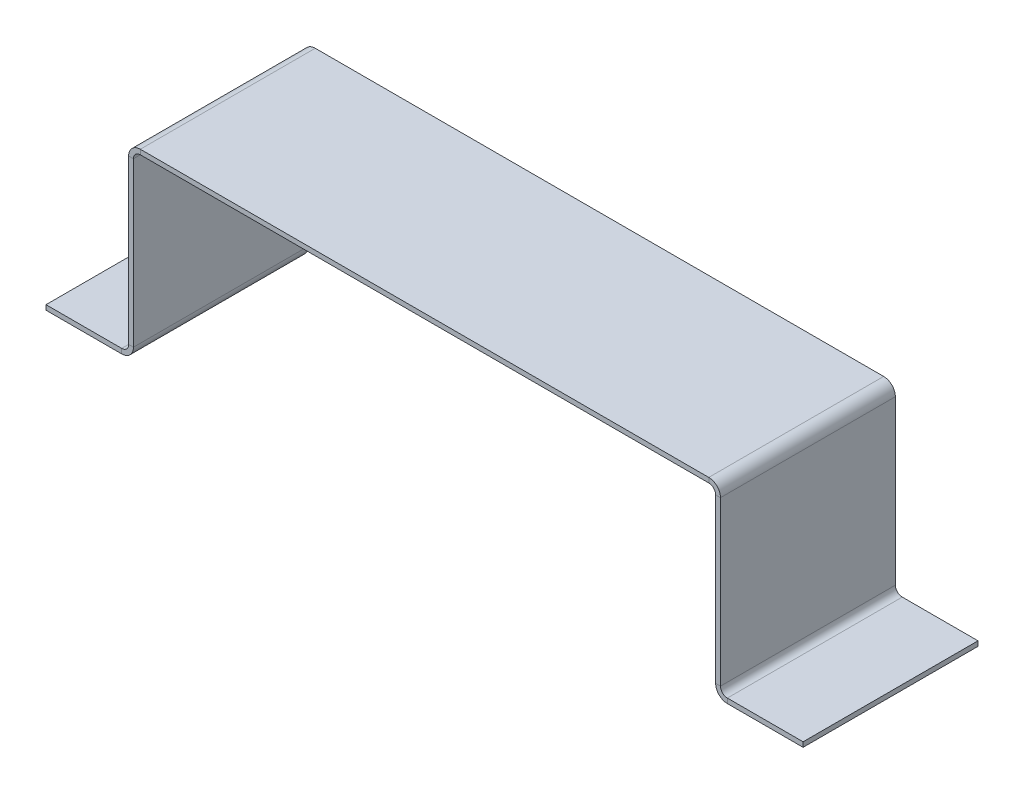
ISO-10303-21;
HEADER;
FILE_DESCRIPTION(('STEP AP214'),'2;1');
FILE_NAME('part.step','',(''),(''),'','','');
FILE_SCHEMA(('AUTOMOTIVE_DESIGN { 1 0 10303 214 1 1 1 1 }'));
ENDSEC;
DATA;
#1=APPLICATION_CONTEXT('core data for automotive mechanical design processes');
#2=APPLICATION_PROTOCOL_DEFINITION('international standard','automotive_design',2000,#1);
#3=PRODUCT_CONTEXT('',#1,'mechanical');
#4=PRODUCT('Part','Part','',(#3));
#5=PRODUCT_RELATED_PRODUCT_CATEGORY('part','',(#4));
#6=PRODUCT_DEFINITION_FORMATION('','',#4);
#7=PRODUCT_DEFINITION_CONTEXT('part definition',#1,'design');
#8=PRODUCT_DEFINITION('design','',#6,#7);
#9=PRODUCT_DEFINITION_SHAPE('','',#8);
#10=(LENGTH_UNIT() NAMED_UNIT(*) SI_UNIT(.MILLI.,.METRE.));
#11=(NAMED_UNIT(*) PLANE_ANGLE_UNIT() SI_UNIT($,.RADIAN.));
#12=(NAMED_UNIT(*) SI_UNIT($,.STERADIAN.) SOLID_ANGLE_UNIT());
#13=UNCERTAINTY_MEASURE_WITH_UNIT(LENGTH_MEASURE(1.E-05),#10,'distance_accuracy_value','');
#14=(GEOMETRIC_REPRESENTATION_CONTEXT(3) GLOBAL_UNCERTAINTY_ASSIGNED_CONTEXT((#13)) GLOBAL_UNIT_ASSIGNED_CONTEXT((#10,
#11,#12)) REPRESENTATION_CONTEXT('',''));
#15=CARTESIAN_POINT('',(0.,0.,0.));
#16=DIRECTION('',(0.,0.,1.));
#17=DIRECTION('',(1.,0.,0.));
#18=AXIS2_PLACEMENT_3D('',#15,#16,#17);
#19=CARTESIAN_POINT('',(-41.275,-0.7,12.7));
#20=DIRECTION('',(0.,0.,1.));
#21=DIRECTION('',(1.,0.,0.));
#22=AXIS2_PLACEMENT_3D('',#19,#20,#21);
#23=PLANE('',#22);
#24=DIRECTION('',(1.,0.,0.));
#25=VECTOR('',#24,1.);
#26=CARTESIAN_POINT('',(-41.275,0.,12.7));
#27=LINE('',#26,#25);
#28=CARTESIAN_POINT('',(-41.275,0.,12.7));
#29=VERTEX_POINT('',#28);
#30=CARTESIAN_POINT('',(41.275,0.,12.7));
#31=VERTEX_POINT('',#30);
#32=EDGE_CURVE('E445',#29,#31,#27,.T.);
#33=ORIENTED_EDGE('',*,*,#32,.F.);
#34=DIRECTION('',(0.,1.,0.));
#35=VECTOR('',#34,1.);
#36=CARTESIAN_POINT('',(-41.275,-0.7,12.7));
#37=LINE('',#36,#35);
#38=CARTESIAN_POINT('',(-41.275,-0.699999999999996,12.7));
#39=VERTEX_POINT('',#38);
#40=EDGE_CURVE('E125',#39,#29,#37,.T.);
#41=ORIENTED_EDGE('',*,*,#40,.F.);
#42=DIRECTION('',(1.,0.,0.));
#43=VECTOR('',#42,1.);
#44=CARTESIAN_POINT('',(-41.275,-0.7,12.7));
#45=LINE('',#44,#43);
#46=CARTESIAN_POINT('',(41.275,-0.699999999999996,12.7));
#47=VERTEX_POINT('',#46);
#48=EDGE_CURVE('E450',#39,#47,#45,.T.);
#49=ORIENTED_EDGE('',*,*,#48,.T.);
#50=DIRECTION('',(0.,1.,0.));
#51=VECTOR('',#50,1.);
#52=CARTESIAN_POINT('',(41.275,-0.7,12.7));
#53=LINE('',#52,#51);
#54=EDGE_CURVE('E13',#47,#31,#53,.T.);
#55=ORIENTED_EDGE('',*,*,#54,.T.);
#56=EDGE_LOOP('',(#33,#41,#49,#55));
#57=FACE_BOUND('',#56,.T.);
#58=ADVANCED_FACE('F116',(#57),#23,.T.);
#59=CARTESIAN_POINT('',(-41.275,-0.7,-12.7));
#60=DIRECTION('',(0.,0.,-1.));
#61=DIRECTION('',(-1.,0.,0.));
#62=AXIS2_PLACEMENT_3D('',#59,#60,#61);
#63=PLANE('',#62);
#64=DIRECTION('',(-1.,0.,0.));
#65=VECTOR('',#64,1.);
#66=CARTESIAN_POINT('',(-41.275,0.,-12.7));
#67=LINE('',#66,#65);
#68=CARTESIAN_POINT('',(41.275,0.,-12.7));
#69=VERTEX_POINT('',#68);
#70=CARTESIAN_POINT('',(-41.275,0.,-12.7));
#71=VERTEX_POINT('',#70);
#72=EDGE_CURVE('E455',#69,#71,#67,.T.);
#73=ORIENTED_EDGE('',*,*,#72,.F.);
#74=DIRECTION('',(0.,1.,0.));
#75=VECTOR('',#74,1.);
#76=CARTESIAN_POINT('',(41.275,-0.7,-12.7));
#77=LINE('',#76,#75);
#78=CARTESIAN_POINT('',(41.275,-0.699999999999996,-12.7));
#79=VERTEX_POINT('',#78);
#80=EDGE_CURVE('E120',#79,#69,#77,.T.);
#81=ORIENTED_EDGE('',*,*,#80,.F.);
#82=DIRECTION('',(-1.,0.,0.));
#83=VECTOR('',#82,1.);
#84=CARTESIAN_POINT('',(-41.275,-0.7,-12.7));
#85=LINE('',#84,#83);
#86=CARTESIAN_POINT('',(-41.275,-0.699999999999996,-12.7));
#87=VERTEX_POINT('',#86);
#88=EDGE_CURVE('E444',#79,#87,#85,.T.);
#89=ORIENTED_EDGE('',*,*,#88,.T.);
#90=DIRECTION('',(0.,1.,0.));
#91=VECTOR('',#90,1.);
#92=CARTESIAN_POINT('',(-41.275,-0.7,-12.7));
#93=LINE('',#92,#91);
#94=EDGE_CURVE('E463',#87,#71,#93,.T.);
#95=ORIENTED_EDGE('',*,*,#94,.T.);
#96=EDGE_LOOP('',(#73,#81,#89,#95));
#97=FACE_BOUND('',#96,.T.);
#98=ADVANCED_FACE('F118',(#97),#63,.T.);
#99=CARTESIAN_POINT('',(0.,-0.7,0.));
#100=DIRECTION('',(0.,-1.,0.));
#101=DIRECTION('',(0.,0.,-1.));
#102=AXIS2_PLACEMENT_3D('',#99,#100,#101);
#103=PLANE('',#102);
#104=DIRECTION('',(0.,0.,-1.));
#105=VECTOR('',#104,1.);
#106=CARTESIAN_POINT('',(41.275,-0.7,12.7));
#107=LINE('',#106,#105);
#108=EDGE_CURVE('E442',#47,#79,#107,.T.);
#109=ORIENTED_EDGE('',*,*,#108,.F.);
#110=ORIENTED_EDGE('',*,*,#48,.F.);
#111=DIRECTION('',(0.,0.,1.));
#112=VECTOR('',#111,1.);
#113=CARTESIAN_POINT('',(-41.275,-0.7,12.7));
#114=LINE('',#113,#112);
#115=EDGE_CURVE('E448',#87,#39,#114,.T.);
#116=ORIENTED_EDGE('',*,*,#115,.F.);
#117=ORIENTED_EDGE('',*,*,#88,.F.);
#118=EDGE_LOOP('',(#109,#110,#116,#117));
#119=FACE_BOUND('',#118,.T.);
#120=ADVANCED_FACE('F486',(#119),#103,.T.);
#121=CARTESIAN_POINT('',(0.,0.,0.));
#122=DIRECTION('',(0.,-1.,0.));
#123=DIRECTION('',(0.,0.,-1.));
#124=AXIS2_PLACEMENT_3D('',#121,#122,#123);
#125=PLANE('',#124);
#126=DIRECTION('',(0.,0.,-1.));
#127=VECTOR('',#126,1.);
#128=CARTESIAN_POINT('',(41.275,0.,12.7));
#129=LINE('',#128,#127);
#130=EDGE_CURVE('E433',#31,#69,#129,.T.);
#131=ORIENTED_EDGE('',*,*,#130,.T.);
#132=ORIENTED_EDGE('',*,*,#72,.T.);
#133=DIRECTION('',(0.,0.,1.));
#134=VECTOR('',#133,1.);
#135=CARTESIAN_POINT('',(-41.275,0.,12.7));
#136=LINE('',#135,#134);
#137=EDGE_CURVE('E458',#71,#29,#136,.T.);
#138=ORIENTED_EDGE('',*,*,#137,.T.);
#139=ORIENTED_EDGE('',*,*,#32,.T.);
#140=EDGE_LOOP('',(#131,#132,#138,#139));
#141=FACE_BOUND('',#140,.T.);
#142=ADVANCED_FACE('F473',(#141),#125,.F.);
#143=CARTESIAN_POINT('',(41.275,-1.7,-12.7));
#144=DIRECTION('',(0.,0.,-1.));
#145=DIRECTION('',(-1.,0.,0.));
#146=AXIS2_PLACEMENT_3D('',#143,#144,#145);
#147=PLANE('',#146);
#148=DIRECTION('',(1.,0.,0.));
#149=VECTOR('',#148,1.);
#150=CARTESIAN_POINT('',(42.975,-1.69999999999999,-12.7));
#151=LINE('',#150,#149);
#152=CARTESIAN_POINT('',(42.275,-1.69999999999999,-12.7));
#153=VERTEX_POINT('',#152);
#154=CARTESIAN_POINT('',(42.975,-1.69999999999999,-12.7));
#155=VERTEX_POINT('',#154);
#156=EDGE_CURVE('E389',#153,#155,#151,.T.);
#157=ORIENTED_EDGE('',*,*,#156,.F.);
#158=CARTESIAN_POINT('',(41.275,-1.7,-12.7));
#159=DIRECTION('',(0.,0.,1.));
#160=DIRECTION('',(1.,0.,0.));
#161=AXIS2_PLACEMENT_3D('',#158,#159,#160);
#162=CIRCLE('',#161,1.);
#163=EDGE_CURVE('E437',#79,#153,#162,.F.);
#164=ORIENTED_EDGE('',*,*,#163,.F.);
#165=ORIENTED_EDGE('',*,*,#80,.T.);
#166=CARTESIAN_POINT('',(41.275,-1.7,-12.7));
#167=DIRECTION('',(0.,0.,1.));
#168=DIRECTION('',(1.,0.,0.));
#169=AXIS2_PLACEMENT_3D('',#166,#167,#168);
#170=CIRCLE('',#169,1.7);
#171=EDGE_CURVE('E141',#69,#155,#170,.F.);
#172=ORIENTED_EDGE('',*,*,#171,.T.);
#173=EDGE_LOOP('',(#157,#164,#165,#172));
#174=FACE_BOUND('',#173,.T.);
#175=ADVANCED_FACE('F470',(#174),#147,.T.);
#176=CARTESIAN_POINT('',(41.275,-1.7,12.7));
#177=DIRECTION('',(0.,0.,-1.));
#178=DIRECTION('',(-1.,0.,0.));
#179=AXIS2_PLACEMENT_3D('',#176,#177,#178);
#180=PLANE('',#179);
#181=CARTESIAN_POINT('',(41.275,-1.7,12.7));
#182=DIRECTION('',(0.,0.,1.));
#183=DIRECTION('',(1.,0.,0.));
#184=AXIS2_PLACEMENT_3D('',#181,#182,#183);
#185=CIRCLE('',#184,1.);
#186=CARTESIAN_POINT('',(42.275,-1.69999999999999,12.7));
#187=VERTEX_POINT('',#186);
#188=EDGE_CURVE('E401',#187,#47,#185,.T.);
#189=ORIENTED_EDGE('',*,*,#188,.F.);
#190=DIRECTION('',(1.,0.,0.));
#191=VECTOR('',#190,1.);
#192=CARTESIAN_POINT('',(42.275,-1.69999999999999,12.7));
#193=LINE('',#192,#191);
#194=CARTESIAN_POINT('',(42.975,-1.69999999999999,12.7));
#195=VERTEX_POINT('',#194);
#196=EDGE_CURVE('E425',#187,#195,#193,.T.);
#197=ORIENTED_EDGE('',*,*,#196,.T.);
#198=CARTESIAN_POINT('',(41.275,-1.7,12.7));
#199=DIRECTION('',(0.,0.,1.));
#200=DIRECTION('',(1.,0.,0.));
#201=AXIS2_PLACEMENT_3D('',#198,#199,#200);
#202=CIRCLE('',#201,1.7);
#203=EDGE_CURVE('E434',#195,#31,#202,.T.);
#204=ORIENTED_EDGE('',*,*,#203,.T.);
#205=ORIENTED_EDGE('',*,*,#54,.F.);
#206=EDGE_LOOP('',(#189,#197,#204,#205));
#207=FACE_BOUND('',#206,.T.);
#208=ADVANCED_FACE('F478',(#207),#180,.F.);
#209=CARTESIAN_POINT('',(41.275,-1.7,12.7));
#210=DIRECTION('',(0.,0.,1.));
#211=DIRECTION('',(1.,0.,0.));
#212=AXIS2_PLACEMENT_3D('',#209,#210,#211);
#213=CYLINDRICAL_SURFACE('',#212,1.7);
#214=ORIENTED_EDGE('',*,*,#130,.F.);
#215=ORIENTED_EDGE('',*,*,#203,.F.);
#216=DIRECTION('',(0.,0.,1.));
#217=VECTOR('',#216,1.);
#218=CARTESIAN_POINT('',(42.975,-1.69999999999999,0.));
#219=LINE('',#218,#217);
#220=EDGE_CURVE('E422',#155,#195,#219,.T.);
#221=ORIENTED_EDGE('',*,*,#220,.F.);
#222=ORIENTED_EDGE('',*,*,#171,.F.);
#223=EDGE_LOOP('',(#214,#215,#221,#222));
#224=FACE_BOUND('',#223,.T.);
#225=ADVANCED_FACE('F475',(#224),#213,.T.);
#226=CARTESIAN_POINT('',(41.275,-1.7,12.7));
#227=DIRECTION('',(0.,0.,1.));
#228=DIRECTION('',(1.,0.,0.));
#229=AXIS2_PLACEMENT_3D('',#226,#227,#228);
#230=CYLINDRICAL_SURFACE('',#229,1.);
#231=ORIENTED_EDGE('',*,*,#108,.T.);
#232=ORIENTED_EDGE('',*,*,#163,.T.);
#233=DIRECTION('',(0.,0.,-1.));
#234=VECTOR('',#233,1.);
#235=CARTESIAN_POINT('',(42.275,-1.69999999999999,-12.7));
#236=LINE('',#235,#234);
#237=EDGE_CURVE('E428',#153,#187,#236,.F.);
#238=ORIENTED_EDGE('',*,*,#237,.T.);
#239=ORIENTED_EDGE('',*,*,#188,.T.);
#240=EDGE_LOOP('',(#231,#232,#238,#239));
#241=FACE_BOUND('',#240,.T.);
#242=ADVANCED_FACE('F488',(#241),#230,.F.);
#243=CARTESIAN_POINT('',(42.975,-0.699999999999998,12.7));
#244=DIRECTION('',(0.,0.,1.));
#245=DIRECTION('',(1.,0.,0.));
#246=AXIS2_PLACEMENT_3D('',#243,#244,#245);
#247=PLANE('',#246);
#248=DIRECTION('',(0.,1.,0.));
#249=VECTOR('',#248,1.);
#250=CARTESIAN_POINT('',(42.975,-0.699999999999998,12.7));
#251=LINE('',#250,#249);
#252=CARTESIAN_POINT('',(42.9750000000001,-25.4,12.7));
#253=VERTEX_POINT('',#252);
#254=EDGE_CURVE('E405',#253,#195,#251,.T.);
#255=ORIENTED_EDGE('',*,*,#254,.T.);
#256=ORIENTED_EDGE('',*,*,#196,.F.);
#257=DIRECTION('',(0.,-1.,0.));
#258=VECTOR('',#257,1.);
#259=CARTESIAN_POINT('',(42.275,1.39143083020455E-13,12.7));
#260=LINE('',#259,#258);
#261=CARTESIAN_POINT('',(42.2750000000001,-25.4,12.7));
#262=VERTEX_POINT('',#261);
#263=EDGE_CURVE('E413',#262,#187,#260,.F.);
#264=ORIENTED_EDGE('',*,*,#263,.F.);
#265=DIRECTION('',(-1.,0.,0.));
#266=VECTOR('',#265,1.);
#267=CARTESIAN_POINT('',(42.9750000000001,-25.4,12.7));
#268=LINE('',#267,#266);
#269=EDGE_CURVE('E398',#253,#262,#268,.T.);
#270=ORIENTED_EDGE('',*,*,#269,.F.);
#271=EDGE_LOOP('',(#255,#256,#264,#270));
#272=FACE_BOUND('',#271,.T.);
#273=ADVANCED_FACE('F496',(#272),#247,.T.);
#274=CARTESIAN_POINT('',(42.9750000000001,-25.4,-12.7));
#275=DIRECTION('',(0.,0.,-1.));
#276=DIRECTION('',(-1.,0.,0.));
#277=AXIS2_PLACEMENT_3D('',#274,#275,#276);
#278=PLANE('',#277);
#279=DIRECTION('',(0.,1.,0.));
#280=VECTOR('',#279,1.);
#281=CARTESIAN_POINT('',(42.275,1.39143083020455E-13,-12.7));
#282=LINE('',#281,#280);
#283=CARTESIAN_POINT('',(42.2750000000001,-25.4,-12.7));
#284=VERTEX_POINT('',#283);
#285=EDGE_CURVE('E419',#153,#284,#282,.F.);
#286=ORIENTED_EDGE('',*,*,#285,.F.);
#287=ORIENTED_EDGE('',*,*,#156,.T.);
#288=DIRECTION('',(0.,-1.,0.));
#289=VECTOR('',#288,1.);
#290=CARTESIAN_POINT('',(42.9750000000001,-25.4,-12.7));
#291=LINE('',#290,#289);
#292=CARTESIAN_POINT('',(42.9750000000001,-25.4,-12.7));
#293=VERTEX_POINT('',#292);
#294=EDGE_CURVE('E410',#155,#293,#291,.T.);
#295=ORIENTED_EDGE('',*,*,#294,.T.);
#296=DIRECTION('',(-1.,0.,0.));
#297=VECTOR('',#296,1.);
#298=CARTESIAN_POINT('',(42.9750000000001,-25.4,-12.7));
#299=LINE('',#298,#297);
#300=EDGE_CURVE('E402',#293,#284,#299,.T.);
#301=ORIENTED_EDGE('',*,*,#300,.T.);
#302=EDGE_LOOP('',(#286,#287,#295,#301));
#303=FACE_BOUND('',#302,.T.);
#304=ADVANCED_FACE('F503',(#303),#278,.T.);
#305=CARTESIAN_POINT('',(42.975,1.41587119957646E-13,0.));
#306=DIRECTION('',(1.,0.,0.));
#307=DIRECTION('',(0.,1.,0.));
#308=AXIS2_PLACEMENT_3D('',#305,#306,#307);
#309=PLANE('',#308);
#310=ORIENTED_EDGE('',*,*,#294,.F.);
#311=ORIENTED_EDGE('',*,*,#220,.T.);
#312=ORIENTED_EDGE('',*,*,#254,.F.);
#313=DIRECTION('',(0.,0.,1.));
#314=VECTOR('',#313,1.);
#315=CARTESIAN_POINT('',(42.9750000000001,-25.4,12.7));
#316=LINE('',#315,#314);
#317=EDGE_CURVE('E408',#293,#253,#316,.T.);
#318=ORIENTED_EDGE('',*,*,#317,.F.);
#319=EDGE_LOOP('',(#310,#311,#312,#318));
#320=FACE_BOUND('',#319,.T.);
#321=ADVANCED_FACE('F501',(#320),#309,.T.);
#322=CARTESIAN_POINT('',(42.275,1.39143083020455E-13,0.));
#323=DIRECTION('',(1.,0.,0.));
#324=DIRECTION('',(0.,1.,0.));
#325=AXIS2_PLACEMENT_3D('',#322,#323,#324);
#326=PLANE('',#325);
#327=ORIENTED_EDGE('',*,*,#237,.F.);
#328=ORIENTED_EDGE('',*,*,#285,.T.);
#329=DIRECTION('',(0.,0.,-1.));
#330=VECTOR('',#329,1.);
#331=CARTESIAN_POINT('',(42.2750000000001,-25.4,0.));
#332=LINE('',#331,#330);
#333=EDGE_CURVE('E416',#284,#262,#332,.F.);
#334=ORIENTED_EDGE('',*,*,#333,.T.);
#335=ORIENTED_EDGE('',*,*,#263,.T.);
#336=EDGE_LOOP('',(#327,#328,#334,#335));
#337=FACE_BOUND('',#336,.T.);
#338=ADVANCED_FACE('F492',(#337),#326,.F.);
#339=CARTESIAN_POINT('',(43.9750000000001,-25.4,12.7));
#340=DIRECTION('',(0.,0.,1.));
#341=DIRECTION('',(1.,0.,0.));
#342=AXIS2_PLACEMENT_3D('',#339,#340,#341);
#343=PLANE('',#342);
#344=DIRECTION('',(0.,1.,0.));
#345=VECTOR('',#344,1.);
#346=CARTESIAN_POINT('',(43.9750000000001,-27.1,12.7));
#347=LINE('',#346,#345);
#348=CARTESIAN_POINT('',(43.9750000000001,-26.4,12.7));
#349=VERTEX_POINT('',#348);
#350=CARTESIAN_POINT('',(43.9750000000001,-27.1,12.7));
#351=VERTEX_POINT('',#350);
#352=EDGE_CURVE('E347',#349,#351,#347,.F.);
#353=ORIENTED_EDGE('',*,*,#352,.F.);
#354=CARTESIAN_POINT('',(43.9750000000001,-25.4,12.7));
#355=DIRECTION('',(0.,0.,-1.));
#356=DIRECTION('',(-1.,0.,0.));
#357=AXIS2_PLACEMENT_3D('',#354,#355,#356);
#358=CIRCLE('',#357,1.);
#359=EDGE_CURVE('E393',#253,#349,#358,.F.);
#360=ORIENTED_EDGE('',*,*,#359,.F.);
#361=ORIENTED_EDGE('',*,*,#269,.T.);
#362=CARTESIAN_POINT('',(43.9750000000001,-25.4,12.7));
#363=DIRECTION('',(0.,0.,-1.));
#364=DIRECTION('',(-1.,0.,0.));
#365=AXIS2_PLACEMENT_3D('',#362,#363,#364);
#366=CIRCLE('',#365,1.7);
#367=EDGE_CURVE('E386',#262,#351,#366,.F.);
#368=ORIENTED_EDGE('',*,*,#367,.T.);
#369=EDGE_LOOP('',(#353,#360,#361,#368));
#370=FACE_BOUND('',#369,.T.);
#371=ADVANCED_FACE('F534',(#370),#343,.T.);
#372=CARTESIAN_POINT('',(43.9750000000001,-25.4,-12.7));
#373=DIRECTION('',(0.,0.,1.));
#374=DIRECTION('',(1.,0.,0.));
#375=AXIS2_PLACEMENT_3D('',#372,#373,#374);
#376=PLANE('',#375);
#377=CARTESIAN_POINT('',(43.9750000000001,-25.4,-12.7));
#378=DIRECTION('',(0.,0.,-1.));
#379=DIRECTION('',(-1.,0.,0.));
#380=AXIS2_PLACEMENT_3D('',#377,#378,#379);
#381=CIRCLE('',#380,1.);
#382=CARTESIAN_POINT('',(43.9750000000001,-26.4,-12.7));
#383=VERTEX_POINT('',#382);
#384=EDGE_CURVE('E359',#383,#293,#381,.T.);
#385=ORIENTED_EDGE('',*,*,#384,.F.);
#386=DIRECTION('',(0.,1.,0.));
#387=VECTOR('',#386,1.);
#388=CARTESIAN_POINT('',(43.9750000000001,-26.4,-12.7));
#389=LINE('',#388,#387);
#390=CARTESIAN_POINT('',(43.9750000000001,-27.1,-12.7));
#391=VERTEX_POINT('',#390);
#392=EDGE_CURVE('E379',#383,#391,#389,.F.);
#393=ORIENTED_EDGE('',*,*,#392,.T.);
#394=CARTESIAN_POINT('',(43.9750000000001,-25.4,-12.7));
#395=DIRECTION('',(0.,0.,-1.));
#396=DIRECTION('',(-1.,0.,0.));
#397=AXIS2_PLACEMENT_3D('',#394,#395,#396);
#398=CIRCLE('',#397,1.7);
#399=EDGE_CURVE('E390',#391,#284,#398,.T.);
#400=ORIENTED_EDGE('',*,*,#399,.T.);
#401=ORIENTED_EDGE('',*,*,#300,.F.);
#402=EDGE_LOOP('',(#385,#393,#400,#401));
#403=FACE_BOUND('',#402,.T.);
#404=ADVANCED_FACE('F506',(#403),#376,.F.);
#405=CARTESIAN_POINT('',(43.9750000000001,-25.4,-12.7));
#406=DIRECTION('',(0.,0.,-1.));
#407=DIRECTION('',(0.,-1.,0.));
#408=AXIS2_PLACEMENT_3D('',#405,#406,#407);
#409=CYLINDRICAL_SURFACE('',#408,1.7);
#410=ORIENTED_EDGE('',*,*,#333,.F.);
#411=ORIENTED_EDGE('',*,*,#399,.F.);
#412=DIRECTION('',(0.,0.,-1.));
#413=VECTOR('',#412,1.);
#414=CARTESIAN_POINT('',(43.9750000000001,-27.1,12.7));
#415=LINE('',#414,#413);
#416=EDGE_CURVE('E377',#391,#351,#415,.F.);
#417=ORIENTED_EDGE('',*,*,#416,.T.);
#418=ORIENTED_EDGE('',*,*,#367,.F.);
#419=EDGE_LOOP('',(#410,#411,#417,#418));
#420=FACE_BOUND('',#419,.T.);
#421=ADVANCED_FACE('F532',(#420),#409,.T.);
#422=CARTESIAN_POINT('',(43.9750000000001,-25.4,-12.7));
#423=DIRECTION('',(0.,0.,-1.));
#424=DIRECTION('',(0.,-1.,0.));
#425=AXIS2_PLACEMENT_3D('',#422,#423,#424);
#426=CYLINDRICAL_SURFACE('',#425,1.);
#427=ORIENTED_EDGE('',*,*,#317,.T.);
#428=ORIENTED_EDGE('',*,*,#359,.T.);
#429=DIRECTION('',(0.,0.,-1.));
#430=VECTOR('',#429,1.);
#431=CARTESIAN_POINT('',(43.9750000000001,-26.4,12.7));
#432=LINE('',#431,#430);
#433=EDGE_CURVE('E382',#349,#383,#432,.T.);
#434=ORIENTED_EDGE('',*,*,#433,.T.);
#435=ORIENTED_EDGE('',*,*,#384,.T.);
#436=EDGE_LOOP('',(#427,#428,#434,#435));
#437=FACE_BOUND('',#436,.T.);
#438=ADVANCED_FACE('F509',(#437),#426,.F.);
#439=CARTESIAN_POINT('',(54.9750000000001,-27.1,-12.7));
#440=DIRECTION('',(0.,0.,1.));
#441=DIRECTION('',(1.,0.,0.));
#442=AXIS2_PLACEMENT_3D('',#439,#440,#441);
#443=PLANE('',#442);
#444=ORIENTED_EDGE('',*,*,#392,.F.);
#445=DIRECTION('',(-1.,0.,0.));
#446=VECTOR('',#445,1.);
#447=CARTESIAN_POINT('',(54.9750000000001,-26.4,-12.7));
#448=LINE('',#447,#446);
#449=CARTESIAN_POINT('',(54.9750000000001,-26.4,-12.7));
#450=VERTEX_POINT('',#449);
#451=EDGE_CURVE('E375',#383,#450,#448,.F.);
#452=ORIENTED_EDGE('',*,*,#451,.T.);
#453=DIRECTION('',(0.,1.,0.));
#454=VECTOR('',#453,1.);
#455=CARTESIAN_POINT('',(54.9750000000001,-27.1,-12.7));
#456=LINE('',#455,#454);
#457=CARTESIAN_POINT('',(54.9750000000001,-27.1,-12.7));
#458=VERTEX_POINT('',#457);
#459=EDGE_CURVE('E356',#458,#450,#456,.T.);
#460=ORIENTED_EDGE('',*,*,#459,.F.);
#461=DIRECTION('',(1.,0.,0.));
#462=VECTOR('',#461,1.);
#463=CARTESIAN_POINT('',(0.,-27.1,-12.7));
#464=LINE('',#463,#462);
#465=EDGE_CURVE('E368',#391,#458,#464,.T.);
#466=ORIENTED_EDGE('',*,*,#465,.F.);
#467=EDGE_LOOP('',(#444,#452,#460,#466));
#468=FACE_BOUND('',#467,.T.);
#469=ADVANCED_FACE('F527',(#468),#443,.F.);
#470=CARTESIAN_POINT('',(42.9750000000001,-27.1,12.7));
#471=DIRECTION('',(0.,0.,-1.));
#472=DIRECTION('',(-1.,0.,0.));
#473=AXIS2_PLACEMENT_3D('',#470,#471,#472);
#474=PLANE('',#473);
#475=ORIENTED_EDGE('',*,*,#352,.T.);
#476=DIRECTION('',(-1.,0.,0.));
#477=VECTOR('',#476,1.);
#478=CARTESIAN_POINT('',(0.,-27.1,12.7));
#479=LINE('',#478,#477);
#480=CARTESIAN_POINT('',(54.9750000000001,-27.1,12.7));
#481=VERTEX_POINT('',#480);
#482=EDGE_CURVE('E363',#481,#351,#479,.T.);
#483=ORIENTED_EDGE('',*,*,#482,.F.);
#484=DIRECTION('',(0.,1.,0.));
#485=VECTOR('',#484,1.);
#486=CARTESIAN_POINT('',(54.9750000000001,-27.1,12.7));
#487=LINE('',#486,#485);
#488=CARTESIAN_POINT('',(54.9750000000001,-26.4,12.7));
#489=VERTEX_POINT('',#488);
#490=EDGE_CURVE('E360',#481,#489,#487,.T.);
#491=ORIENTED_EDGE('',*,*,#490,.T.);
#492=DIRECTION('',(1.,0.,0.));
#493=VECTOR('',#492,1.);
#494=CARTESIAN_POINT('',(42.9750000000001,-26.4,12.7));
#495=LINE('',#494,#493);
#496=EDGE_CURVE('E370',#489,#349,#495,.F.);
#497=ORIENTED_EDGE('',*,*,#496,.T.);
#498=EDGE_LOOP('',(#475,#483,#491,#497));
#499=FACE_BOUND('',#498,.T.);
#500=ADVANCED_FACE('F518',(#499),#474,.F.);
#501=CARTESIAN_POINT('',(0.,-27.1,0.));
#502=DIRECTION('',(0.,1.,0.));
#503=DIRECTION('',(0.,0.,1.));
#504=AXIS2_PLACEMENT_3D('',#501,#502,#503);
#505=PLANE('',#504);
#506=ORIENTED_EDGE('',*,*,#416,.F.);
#507=ORIENTED_EDGE('',*,*,#465,.T.);
#508=DIRECTION('',(0.,0.,1.));
#509=VECTOR('',#508,1.);
#510=CARTESIAN_POINT('',(54.9750000000001,-27.1,0.));
#511=LINE('',#510,#509);
#512=EDGE_CURVE('E366',#458,#481,#511,.T.);
#513=ORIENTED_EDGE('',*,*,#512,.T.);
#514=ORIENTED_EDGE('',*,*,#482,.T.);
#515=EDGE_LOOP('',(#506,#507,#513,#514));
#516=FACE_BOUND('',#515,.T.);
#517=ADVANCED_FACE('F530',(#516),#505,.F.);
#518=CARTESIAN_POINT('',(0.,-26.4,0.));
#519=DIRECTION('',(0.,1.,0.));
#520=DIRECTION('',(0.,0.,1.));
#521=AXIS2_PLACEMENT_3D('',#518,#519,#520);
#522=PLANE('',#521);
#523=ORIENTED_EDGE('',*,*,#451,.F.);
#524=ORIENTED_EDGE('',*,*,#433,.F.);
#525=ORIENTED_EDGE('',*,*,#496,.F.);
#526=DIRECTION('',(0.,0.,-1.));
#527=VECTOR('',#526,1.);
#528=CARTESIAN_POINT('',(54.9750000000001,-26.4,12.7));
#529=LINE('',#528,#527);
#530=EDGE_CURVE('E373',#450,#489,#529,.F.);
#531=ORIENTED_EDGE('',*,*,#530,.F.);
#532=EDGE_LOOP('',(#523,#524,#525,#531));
#533=FACE_BOUND('',#532,.T.);
#534=ADVANCED_FACE('F515',(#533),#522,.T.);
#535=CARTESIAN_POINT('',(54.9750000000001,-27.1,12.7));
#536=DIRECTION('',(-1.,0.,0.));
#537=DIRECTION('',(0.,-1.,0.));
#538=AXIS2_PLACEMENT_3D('',#535,#536,#537);
#539=PLANE('',#538);
#540=ORIENTED_EDGE('',*,*,#530,.T.);
#541=ORIENTED_EDGE('',*,*,#490,.F.);
#542=ORIENTED_EDGE('',*,*,#512,.F.);
#543=ORIENTED_EDGE('',*,*,#459,.T.);
#544=EDGE_LOOP('',(#540,#541,#542,#543));
#545=FACE_BOUND('',#544,.T.);
#546=ADVANCED_FACE('F523',(#545),#539,.F.);
#547=CARTESIAN_POINT('',(-41.275,-1.7,12.7));
#548=DIRECTION('',(0.,0.,1.));
#549=DIRECTION('',(1.,0.,0.));
#550=AXIS2_PLACEMENT_3D('',#547,#548,#549);
#551=PLANE('',#550);
#552=DIRECTION('',(-1.,0.,0.));
#553=VECTOR('',#552,1.);
#554=CARTESIAN_POINT('',(-42.975,-1.69999999999999,12.7));
#555=LINE('',#554,#553);
#556=CARTESIAN_POINT('',(-42.275,-1.69999999999999,12.7));
#557=VERTEX_POINT('',#556);
#558=CARTESIAN_POINT('',(-42.975,-1.69999999999999,12.7));
#559=VERTEX_POINT('',#558);
#560=EDGE_CURVE('E310',#557,#559,#555,.T.);
#561=ORIENTED_EDGE('',*,*,#560,.F.);
#562=CARTESIAN_POINT('',(-41.275,-1.7,12.7));
#563=DIRECTION('',(0.,0.,-1.));
#564=DIRECTION('',(-1.,0.,0.));
#565=AXIS2_PLACEMENT_3D('',#562,#563,#564);
#566=CIRCLE('',#565,1.);
#567=EDGE_CURVE('E351',#39,#557,#566,.F.);
#568=ORIENTED_EDGE('',*,*,#567,.F.);
#569=ORIENTED_EDGE('',*,*,#40,.T.);
#570=CARTESIAN_POINT('',(-41.275,-1.7,12.7));
#571=DIRECTION('',(0.,0.,-1.));
#572=DIRECTION('',(-1.,0.,0.));
#573=AXIS2_PLACEMENT_3D('',#570,#571,#572);
#574=CIRCLE('',#573,1.7);
#575=EDGE_CURVE('E133',#29,#559,#574,.F.);
#576=ORIENTED_EDGE('',*,*,#575,.T.);
#577=EDGE_LOOP('',(#561,#568,#569,#576));
#578=FACE_BOUND('',#577,.T.);
#579=ADVANCED_FACE('F648',(#578),#551,.T.);
#580=CARTESIAN_POINT('',(-41.275,-1.7,-12.7));
#581=DIRECTION('',(0.,0.,1.));
#582=DIRECTION('',(1.,0.,0.));
#583=AXIS2_PLACEMENT_3D('',#580,#581,#582);
#584=PLANE('',#583);
#585=CARTESIAN_POINT('',(-41.275,-1.7,-12.7));
#586=DIRECTION('',(0.,0.,-1.));
#587=DIRECTION('',(-1.,0.,0.));
#588=AXIS2_PLACEMENT_3D('',#585,#586,#587);
#589=CIRCLE('',#588,1.);
#590=CARTESIAN_POINT('',(-42.275,-1.69999999999999,-12.7));
#591=VERTEX_POINT('',#590);
#592=EDGE_CURVE('E318',#591,#87,#589,.T.);
#593=ORIENTED_EDGE('',*,*,#592,.F.);
#594=DIRECTION('',(-1.,0.,0.));
#595=VECTOR('',#594,1.);
#596=CARTESIAN_POINT('',(-42.275,-1.69999999999999,-12.7));
#597=LINE('',#596,#595);
#598=CARTESIAN_POINT('',(-42.975,-1.69999999999999,-12.7));
#599=VERTEX_POINT('',#598);
#600=EDGE_CURVE('E339',#591,#599,#597,.T.);
#601=ORIENTED_EDGE('',*,*,#600,.T.);
#602=CARTESIAN_POINT('',(-41.275,-1.7,-12.7));
#603=DIRECTION('',(0.,0.,-1.));
#604=DIRECTION('',(-1.,0.,0.));
#605=AXIS2_PLACEMENT_3D('',#602,#603,#604);
#606=CIRCLE('',#605,1.7);
#607=EDGE_CURVE('E348',#599,#71,#606,.T.);
#608=ORIENTED_EDGE('',*,*,#607,.T.);
#609=ORIENTED_EDGE('',*,*,#94,.F.);
#610=EDGE_LOOP('',(#593,#601,#608,#609));
#611=FACE_BOUND('',#610,.T.);
#612=ADVANCED_FACE('F686',(#611),#584,.F.);
#613=CARTESIAN_POINT('',(-41.275,-1.7,-12.7));
#614=DIRECTION('',(0.,0.,-1.));
#615=DIRECTION('',(-1.,0.,0.));
#616=AXIS2_PLACEMENT_3D('',#613,#614,#615);
#617=CYLINDRICAL_SURFACE('',#616,1.7);
#618=ORIENTED_EDGE('',*,*,#137,.F.);
#619=ORIENTED_EDGE('',*,*,#607,.F.);
#620=DIRECTION('',(0.,0.,-1.));
#621=VECTOR('',#620,1.);
#622=CARTESIAN_POINT('',(-42.975,-1.69999999999999,0.));
#623=LINE('',#622,#621);
#624=EDGE_CURVE('E336',#559,#599,#623,.T.);
#625=ORIENTED_EDGE('',*,*,#624,.F.);
#626=ORIENTED_EDGE('',*,*,#575,.F.);
#627=EDGE_LOOP('',(#618,#619,#625,#626));
#628=FACE_BOUND('',#627,.T.);
#629=ADVANCED_FACE('F697',(#628),#617,.T.);
#630=CARTESIAN_POINT('',(-41.275,-1.7,-12.7));
#631=DIRECTION('',(0.,0.,-1.));
#632=DIRECTION('',(-1.,0.,0.));
#633=AXIS2_PLACEMENT_3D('',#630,#631,#632);
#634=CYLINDRICAL_SURFACE('',#633,1.);
#635=ORIENTED_EDGE('',*,*,#115,.T.);
#636=ORIENTED_EDGE('',*,*,#567,.T.);
#637=DIRECTION('',(0.,0.,1.));
#638=VECTOR('',#637,1.);
#639=CARTESIAN_POINT('',(-42.275,-1.69999999999999,12.7));
#640=LINE('',#639,#638);
#641=EDGE_CURVE('E342',#557,#591,#640,.F.);
#642=ORIENTED_EDGE('',*,*,#641,.T.);
#643=ORIENTED_EDGE('',*,*,#592,.T.);
#644=EDGE_LOOP('',(#635,#636,#642,#643));
#645=FACE_BOUND('',#644,.T.);
#646=ADVANCED_FACE('F708',(#645),#634,.F.);
#647=CARTESIAN_POINT('',(-42.975,-0.699999999999998,-12.7));
#648=DIRECTION('',(0.,0.,-1.));
#649=DIRECTION('',(-1.,0.,0.));
#650=AXIS2_PLACEMENT_3D('',#647,#648,#649);
#651=PLANE('',#650);
#652=DIRECTION('',(0.,1.,0.));
#653=VECTOR('',#652,1.);
#654=CARTESIAN_POINT('',(-42.975,-0.699999999999998,-12.7));
#655=LINE('',#654,#653);
#656=CARTESIAN_POINT('',(-42.9750000000001,-25.4,-12.7));
#657=VERTEX_POINT('',#656);
#658=EDGE_CURVE('E322',#657,#599,#655,.T.);
#659=ORIENTED_EDGE('',*,*,#658,.T.);
#660=ORIENTED_EDGE('',*,*,#600,.F.);
#661=DIRECTION('',(0.,-1.,0.));
#662=VECTOR('',#661,1.);
#663=CARTESIAN_POINT('',(-42.275,1.39143083020455E-13,-12.7));
#664=LINE('',#663,#662);
#665=CARTESIAN_POINT('',(-42.2750000000001,-25.4,-12.7));
#666=VERTEX_POINT('',#665);
#667=EDGE_CURVE('E330',#666,#591,#664,.F.);
#668=ORIENTED_EDGE('',*,*,#667,.F.);
#669=DIRECTION('',(1.,0.,0.));
#670=VECTOR('',#669,1.);
#671=CARTESIAN_POINT('',(-42.9750000000001,-25.4,-12.7));
#672=LINE('',#671,#670);
#673=EDGE_CURVE('E315',#657,#666,#672,.T.);
#674=ORIENTED_EDGE('',*,*,#673,.F.);
#675=EDGE_LOOP('',(#659,#660,#668,#674));
#676=FACE_BOUND('',#675,.T.);
#677=ADVANCED_FACE('F718',(#676),#651,.T.);
#678=CARTESIAN_POINT('',(-42.9750000000001,-25.4,12.7));
#679=DIRECTION('',(0.,0.,1.));
#680=DIRECTION('',(1.,0.,0.));
#681=AXIS2_PLACEMENT_3D('',#678,#679,#680);
#682=PLANE('',#681);
#683=DIRECTION('',(0.,1.,0.));
#684=VECTOR('',#683,1.);
#685=CARTESIAN_POINT('',(-42.275,1.39143083020455E-13,12.7));
#686=LINE('',#685,#684);
#687=CARTESIAN_POINT('',(-42.2750000000001,-25.4,12.7));
#688=VERTEX_POINT('',#687);
#689=EDGE_CURVE('E334',#557,#688,#686,.F.);
#690=ORIENTED_EDGE('',*,*,#689,.F.);
#691=ORIENTED_EDGE('',*,*,#560,.T.);
#692=DIRECTION('',(0.,-1.,0.));
#693=VECTOR('',#692,1.);
#694=CARTESIAN_POINT('',(-42.9750000000001,-25.4,12.7));
#695=LINE('',#694,#693);
#696=CARTESIAN_POINT('',(-42.9750000000001,-25.4,12.7));
#697=VERTEX_POINT('',#696);
#698=EDGE_CURVE('E327',#559,#697,#695,.T.);
#699=ORIENTED_EDGE('',*,*,#698,.T.);
#700=DIRECTION('',(1.,0.,0.));
#701=VECTOR('',#700,1.);
#702=CARTESIAN_POINT('',(-42.9750000000001,-25.4,12.7));
#703=LINE('',#702,#701);
#704=EDGE_CURVE('E319',#697,#688,#703,.T.);
#705=ORIENTED_EDGE('',*,*,#704,.T.);
#706=EDGE_LOOP('',(#690,#691,#699,#705));
#707=FACE_BOUND('',#706,.T.);
#708=ADVANCED_FACE('F729',(#707),#682,.T.);
#709=CARTESIAN_POINT('',(-42.975,1.41587119957646E-13,0.));
#710=DIRECTION('',(-1.,0.,0.));
#711=DIRECTION('',(0.,-1.,0.));
#712=AXIS2_PLACEMENT_3D('',#709,#710,#711);
#713=PLANE('',#712);
#714=ORIENTED_EDGE('',*,*,#698,.F.);
#715=ORIENTED_EDGE('',*,*,#624,.T.);
#716=ORIENTED_EDGE('',*,*,#658,.F.);
#717=DIRECTION('',(0.,0.,-1.));
#718=VECTOR('',#717,1.);
#719=CARTESIAN_POINT('',(-42.9750000000001,-25.4,-12.7));
#720=LINE('',#719,#718);
#721=EDGE_CURVE('E325',#697,#657,#720,.T.);
#722=ORIENTED_EDGE('',*,*,#721,.F.);
#723=EDGE_LOOP('',(#714,#715,#716,#722));
#724=FACE_BOUND('',#723,.T.);
#725=ADVANCED_FACE('F740',(#724),#713,.T.);
#726=CARTESIAN_POINT('',(-42.275,1.39143083020455E-13,0.));
#727=DIRECTION('',(-1.,0.,0.));
#728=DIRECTION('',(0.,-1.,0.));
#729=AXIS2_PLACEMENT_3D('',#726,#727,#728);
#730=PLANE('',#729);
#731=ORIENTED_EDGE('',*,*,#641,.F.);
#732=ORIENTED_EDGE('',*,*,#689,.T.);
#733=DIRECTION('',(0.,0.,1.));
#734=VECTOR('',#733,1.);
#735=CARTESIAN_POINT('',(-42.2750000000001,-25.4,0.));
#736=LINE('',#735,#734);
#737=EDGE_CURVE('E261',#688,#666,#736,.F.);
#738=ORIENTED_EDGE('',*,*,#737,.T.);
#739=ORIENTED_EDGE('',*,*,#667,.T.);
#740=EDGE_LOOP('',(#731,#732,#738,#739));
#741=FACE_BOUND('',#740,.T.);
#742=ADVANCED_FACE('F751',(#741),#730,.F.);
#743=CARTESIAN_POINT('',(-43.9750000000001,-25.4,-12.7));
#744=DIRECTION('',(0.,0.,-1.));
#745=DIRECTION('',(-1.,0.,0.));
#746=AXIS2_PLACEMENT_3D('',#743,#744,#745);
#747=PLANE('',#746);
#748=DIRECTION('',(0.,-1.,0.));
#749=VECTOR('',#748,1.);
#750=CARTESIAN_POINT('',(-43.9750000000001,-27.1,-12.7));
#751=LINE('',#750,#749);
#752=CARTESIAN_POINT('',(-43.9750000000001,-26.4,-12.7));
#753=VERTEX_POINT('',#752);
#754=CARTESIAN_POINT('',(-43.9750000000001,-27.1,-12.7));
#755=VERTEX_POINT('',#754);
#756=EDGE_CURVE('E307',#753,#755,#751,.T.);
#757=ORIENTED_EDGE('',*,*,#756,.F.);
#758=CARTESIAN_POINT('',(-43.9750000000001,-25.4,-12.7));
#759=DIRECTION('',(0.,0.,1.));
#760=DIRECTION('',(1.,0.,0.));
#761=AXIS2_PLACEMENT_3D('',#758,#759,#760);
#762=CIRCLE('',#761,1.);
#763=EDGE_CURVE('E265',#657,#753,#762,.F.);
#764=ORIENTED_EDGE('',*,*,#763,.F.);
#765=ORIENTED_EDGE('',*,*,#673,.T.);
#766=CARTESIAN_POINT('',(-43.9750000000001,-25.4,-12.7));
#767=DIRECTION('',(0.,0.,1.));
#768=DIRECTION('',(1.,0.,0.));
#769=AXIS2_PLACEMENT_3D('',#766,#767,#768);
#770=CIRCLE('',#769,1.7);
#771=EDGE_CURVE('E264',#666,#755,#770,.F.);
#772=ORIENTED_EDGE('',*,*,#771,.T.);
#773=EDGE_LOOP('',(#757,#764,#765,#772));
#774=FACE_BOUND('',#773,.T.);
#775=ADVANCED_FACE('F762',(#774),#747,.T.);
#776=CARTESIAN_POINT('',(-43.9750000000001,-25.4,12.7));
#777=DIRECTION('',(0.,0.,-1.));
#778=DIRECTION('',(-1.,0.,0.));
#779=AXIS2_PLACEMENT_3D('',#776,#777,#778);
#780=PLANE('',#779);
#781=CARTESIAN_POINT('',(-43.9750000000001,-25.4,12.7));
#782=DIRECTION('',(0.,0.,1.));
#783=DIRECTION('',(1.,0.,0.));
#784=AXIS2_PLACEMENT_3D('',#781,#782,#783);
#785=CIRCLE('',#784,1.);
#786=CARTESIAN_POINT('',(-43.9750000000001,-26.4,12.7));
#787=VERTEX_POINT('',#786);
#788=EDGE_CURVE('E272',#787,#697,#785,.T.);
#789=ORIENTED_EDGE('',*,*,#788,.F.);
#790=DIRECTION('',(0.,-1.,0.));
#791=VECTOR('',#790,1.);
#792=CARTESIAN_POINT('',(-43.9750000000001,-26.4,12.7));
#793=LINE('',#792,#791);
#794=CARTESIAN_POINT('',(-43.9750000000001,-27.1,12.7));
#795=VERTEX_POINT('',#794);
#796=EDGE_CURVE('E269',#787,#795,#793,.T.);
#797=ORIENTED_EDGE('',*,*,#796,.T.);
#798=CARTESIAN_POINT('',(-43.9750000000001,-25.4,12.7));
#799=DIRECTION('',(0.,0.,1.));
#800=DIRECTION('',(1.,0.,0.));
#801=AXIS2_PLACEMENT_3D('',#798,#799,#800);
#802=CIRCLE('',#801,1.7);
#803=EDGE_CURVE('E254',#795,#688,#802,.T.);
#804=ORIENTED_EDGE('',*,*,#803,.T.);
#805=ORIENTED_EDGE('',*,*,#704,.F.);
#806=EDGE_LOOP('',(#789,#797,#804,#805));
#807=FACE_BOUND('',#806,.T.);
#808=ADVANCED_FACE('F270',(#807),#780,.F.);
#809=CARTESIAN_POINT('',(-43.9750000000001,-25.4,12.7));
#810=DIRECTION('',(0.,0.,1.));
#811=DIRECTION('',(0.,-1.,0.));
#812=AXIS2_PLACEMENT_3D('',#809,#810,#811);
#813=CYLINDRICAL_SURFACE('',#812,1.7);
#814=ORIENTED_EDGE('',*,*,#737,.F.);
#815=ORIENTED_EDGE('',*,*,#803,.F.);
#816=DIRECTION('',(0.,0.,1.));
#817=VECTOR('',#816,1.);
#818=CARTESIAN_POINT('',(-43.9750000000001,-27.1,0.));
#819=LINE('',#818,#817);
#820=EDGE_CURVE('E258',#755,#795,#819,.T.);
#821=ORIENTED_EDGE('',*,*,#820,.F.);
#822=ORIENTED_EDGE('',*,*,#771,.F.);
#823=EDGE_LOOP('',(#814,#815,#821,#822));
#824=FACE_BOUND('',#823,.T.);
#825=ADVANCED_FACE('F256',(#824),#813,.T.);
#826=CARTESIAN_POINT('',(-43.9750000000001,-25.4,12.7));
#827=DIRECTION('',(0.,0.,1.));
#828=DIRECTION('',(0.,-1.,0.));
#829=AXIS2_PLACEMENT_3D('',#826,#827,#828);
#830=CYLINDRICAL_SURFACE('',#829,1.);
#831=ORIENTED_EDGE('',*,*,#721,.T.);
#832=ORIENTED_EDGE('',*,*,#763,.T.);
#833=DIRECTION('',(0.,0.,-1.));
#834=VECTOR('',#833,1.);
#835=CARTESIAN_POINT('',(-43.9750000000001,-26.4,-12.7));
#836=LINE('',#835,#834);
#837=EDGE_CURVE('E277',#753,#787,#836,.F.);
#838=ORIENTED_EDGE('',*,*,#837,.T.);
#839=ORIENTED_EDGE('',*,*,#788,.T.);
#840=EDGE_LOOP('',(#831,#832,#838,#839));
#841=FACE_BOUND('',#840,.T.);
#842=ADVANCED_FACE('F792',(#841),#830,.F.);
#843=CARTESIAN_POINT('',(-42.9750000000001,-27.1,12.7));
#844=DIRECTION('',(0.,0.,1.));
#845=DIRECTION('',(1.,0.,0.));
#846=AXIS2_PLACEMENT_3D('',#843,#844,#845);
#847=PLANE('',#846);
#848=DIRECTION('',(1.,0.,0.));
#849=VECTOR('',#848,1.);
#850=CARTESIAN_POINT('',(-42.9750000000001,-27.1,12.7));
#851=LINE('',#850,#849);
#852=CARTESIAN_POINT('',(-54.9750000000001,-27.1,12.7));
#853=VERTEX_POINT('',#852);
#854=EDGE_CURVE('E284',#853,#795,#851,.T.);
#855=ORIENTED_EDGE('',*,*,#854,.T.);
#856=ORIENTED_EDGE('',*,*,#796,.F.);
#857=DIRECTION('',(-1.,0.,0.));
#858=VECTOR('',#857,1.);
#859=CARTESIAN_POINT('',(0.,-26.4,12.7));
#860=LINE('',#859,#858);
#861=CARTESIAN_POINT('',(-54.9750000000001,-26.4,12.7));
#862=VERTEX_POINT('',#861);
#863=EDGE_CURVE('E300',#862,#787,#860,.F.);
#864=ORIENTED_EDGE('',*,*,#863,.F.);
#865=DIRECTION('',(0.,1.,0.));
#866=VECTOR('',#865,1.);
#867=CARTESIAN_POINT('',(-54.9750000000001,-27.1,12.7));
#868=LINE('',#867,#866);
#869=EDGE_CURVE('E289',#853,#862,#868,.T.);
#870=ORIENTED_EDGE('',*,*,#869,.F.);
#871=EDGE_LOOP('',(#855,#856,#864,#870));
#872=FACE_BOUND('',#871,.T.);
#873=ADVANCED_FACE('F288',(#872),#847,.T.);
#874=CARTESIAN_POINT('',(-54.9750000000001,-27.1,-12.7));
#875=DIRECTION('',(0.,0.,-1.));
#876=DIRECTION('',(-1.,0.,0.));
#877=AXIS2_PLACEMENT_3D('',#874,#875,#876);
#878=PLANE('',#877);
#879=DIRECTION('',(1.,0.,0.));
#880=VECTOR('',#879,1.);
#881=CARTESIAN_POINT('',(0.,-26.4,-12.7));
#882=LINE('',#881,#880);
#883=CARTESIAN_POINT('',(-54.9750000000001,-26.4,-12.7));
#884=VERTEX_POINT('',#883);
#885=EDGE_CURVE('E286',#753,#884,#882,.F.);
#886=ORIENTED_EDGE('',*,*,#885,.F.);
#887=ORIENTED_EDGE('',*,*,#756,.T.);
#888=DIRECTION('',(-1.,0.,0.));
#889=VECTOR('',#888,1.);
#890=CARTESIAN_POINT('',(-54.9750000000001,-27.1,-12.7));
#891=LINE('',#890,#889);
#892=CARTESIAN_POINT('',(-54.9750000000001,-27.1,-12.7));
#893=VERTEX_POINT('',#892);
#894=EDGE_CURVE('E285',#755,#893,#891,.T.);
#895=ORIENTED_EDGE('',*,*,#894,.T.);
#896=DIRECTION('',(0.,1.,0.));
#897=VECTOR('',#896,1.);
#898=CARTESIAN_POINT('',(-54.9750000000001,-27.1,-12.7));
#899=LINE('',#898,#897);
#900=EDGE_CURVE('E291',#893,#884,#899,.T.);
#901=ORIENTED_EDGE('',*,*,#900,.T.);
#902=EDGE_LOOP('',(#886,#887,#895,#901));
#903=FACE_BOUND('',#902,.T.);
#904=ADVANCED_FACE('F812',(#903),#878,.T.);
#905=CARTESIAN_POINT('',(0.,-27.1,0.));
#906=DIRECTION('',(0.,-1.,0.));
#907=DIRECTION('',(0.,0.,-1.));
#908=AXIS2_PLACEMENT_3D('',#905,#906,#907);
#909=PLANE('',#908);
#910=ORIENTED_EDGE('',*,*,#894,.F.);
#911=ORIENTED_EDGE('',*,*,#820,.T.);
#912=ORIENTED_EDGE('',*,*,#854,.F.);
#913=DIRECTION('',(0.,0.,1.));
#914=VECTOR('',#913,1.);
#915=CARTESIAN_POINT('',(-54.9750000000001,-27.1,12.7));
#916=LINE('',#915,#914);
#917=EDGE_CURVE('E292',#893,#853,#916,.T.);
#918=ORIENTED_EDGE('',*,*,#917,.F.);
#919=EDGE_LOOP('',(#910,#911,#912,#918));
#920=FACE_BOUND('',#919,.T.);
#921=ADVANCED_FACE('F282',(#920),#909,.T.);
#922=CARTESIAN_POINT('',(0.,-26.4,0.));
#923=DIRECTION('',(0.,-1.,0.));
#924=DIRECTION('',(0.,0.,-1.));
#925=AXIS2_PLACEMENT_3D('',#922,#923,#924);
#926=PLANE('',#925);
#927=ORIENTED_EDGE('',*,*,#837,.F.);
#928=ORIENTED_EDGE('',*,*,#885,.T.);
#929=DIRECTION('',(0.,0.,-1.));
#930=VECTOR('',#929,1.);
#931=CARTESIAN_POINT('',(-54.9750000000001,-26.4,0.));
#932=LINE('',#931,#930);
#933=EDGE_CURVE('E302',#884,#862,#932,.F.);
#934=ORIENTED_EDGE('',*,*,#933,.T.);
#935=ORIENTED_EDGE('',*,*,#863,.T.);
#936=EDGE_LOOP('',(#927,#928,#934,#935));
#937=FACE_BOUND('',#936,.T.);
#938=ADVANCED_FACE('F832',(#937),#926,.F.);
#939=CARTESIAN_POINT('',(-54.9750000000001,-27.1,12.7));
#940=DIRECTION('',(-1.,0.,0.));
#941=DIRECTION('',(0.,-1.,0.));
#942=AXIS2_PLACEMENT_3D('',#939,#940,#941);
#943=PLANE('',#942);
#944=ORIENTED_EDGE('',*,*,#933,.F.);
#945=ORIENTED_EDGE('',*,*,#900,.F.);
#946=ORIENTED_EDGE('',*,*,#917,.T.);
#947=ORIENTED_EDGE('',*,*,#869,.T.);
#948=EDGE_LOOP('',(#944,#945,#946,#947));
#949=FACE_BOUND('',#948,.T.);
#950=ADVANCED_FACE('F842',(#949),#943,.T.);
#951=CLOSED_SHELL('',(#58,#98,#120,#142,#175,#208,#225,#242,#273,#304,#321,#338,#371,#404,#421,
#438,#469,#500,#517,#534,#546,#579,#612,#629,#646,#677,#708,#725,#742,#775,#808,#825,#842,#873,
#904,#921,#938,#950));
#952=MANIFOLD_SOLID_BREP('B2',#951);
#953=ADVANCED_BREP_SHAPE_REPRESENTATION('',(#18,#952),#14);
#954=SHAPE_DEFINITION_REPRESENTATION(#9,#953);
ENDSEC;
END-ISO-10303-21;
